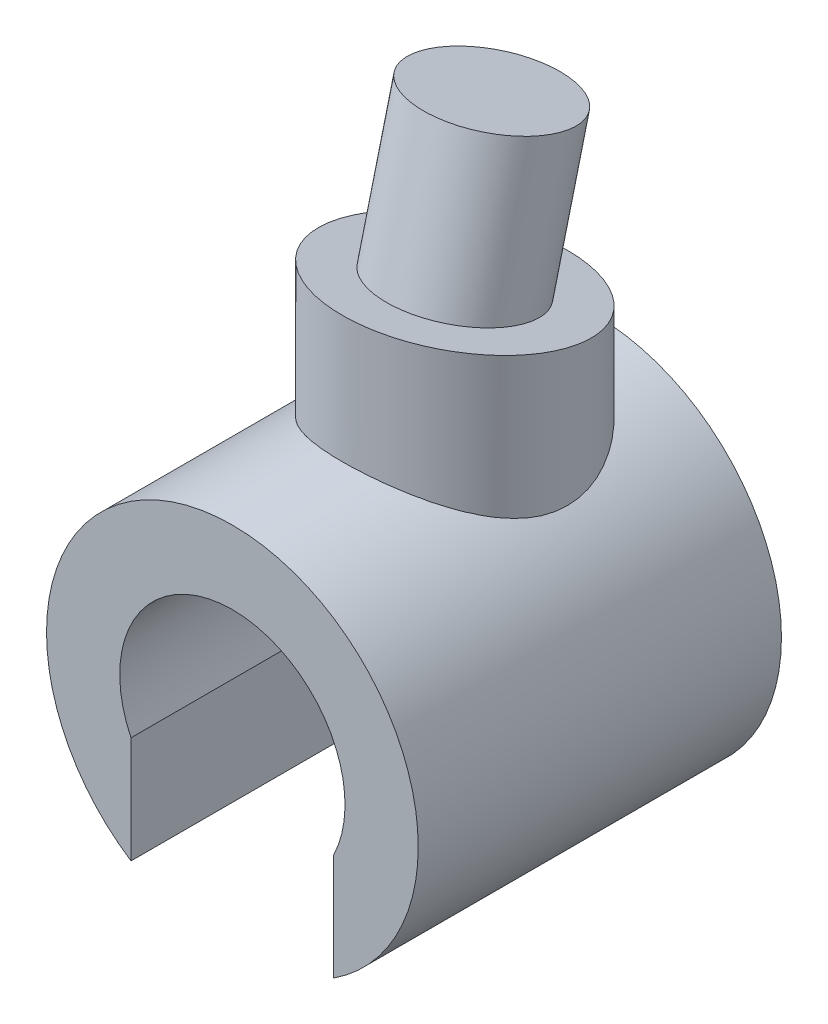
ISO-10303-21;
HEADER;
FILE_DESCRIPTION(('STEP AP214'),'2;1');
FILE_NAME('part.step','',(''),(''),'','','');
FILE_SCHEMA(('AUTOMOTIVE_DESIGN { 1 0 10303 214 1 1 1 1 }'));
ENDSEC;
DATA;
#1=APPLICATION_CONTEXT('core data for automotive mechanical design processes');
#2=APPLICATION_PROTOCOL_DEFINITION('international standard','automotive_design',2000,#1);
#3=PRODUCT_CONTEXT('',#1,'mechanical');
#4=PRODUCT('Part','Part','',(#3));
#5=PRODUCT_RELATED_PRODUCT_CATEGORY('part','',(#4));
#6=PRODUCT_DEFINITION_FORMATION('','',#4);
#7=PRODUCT_DEFINITION_CONTEXT('part definition',#1,'design');
#8=PRODUCT_DEFINITION('design','',#6,#7);
#9=PRODUCT_DEFINITION_SHAPE('','',#8);
#10=(LENGTH_UNIT() NAMED_UNIT(*) SI_UNIT(.MILLI.,.METRE.));
#11=(NAMED_UNIT(*) PLANE_ANGLE_UNIT() SI_UNIT($,.RADIAN.));
#12=(NAMED_UNIT(*) SI_UNIT($,.STERADIAN.) SOLID_ANGLE_UNIT());
#13=UNCERTAINTY_MEASURE_WITH_UNIT(LENGTH_MEASURE(1.E-05),#10,'distance_accuracy_value','');
#14=(GEOMETRIC_REPRESENTATION_CONTEXT(3) GLOBAL_UNCERTAINTY_ASSIGNED_CONTEXT((#13)) GLOBAL_UNIT_ASSIGNED_CONTEXT((#10,
#11,#12)) REPRESENTATION_CONTEXT('',''));
#15=CARTESIAN_POINT('',(0.,0.,0.));
#16=DIRECTION('',(0.,0.,1.));
#17=DIRECTION('',(1.,0.,0.));
#18=AXIS2_PLACEMENT_3D('',#15,#16,#17);
#19=CARTESIAN_POINT('',(0.,4.29644475293883,-1.45));
#20=DIRECTION('',(0.,-1.,0.));
#21=DIRECTION('',(0.,0.,-1.));
#22=AXIS2_PLACEMENT_3D('',#19,#20,#21);
#23=CYLINDRICAL_SURFACE('',#22,4.);
#24=CARTESIAN_POINT('',(0.,10.1,-1.45));
#25=DIRECTION('',(0.,-0.970142500145332,0.242535625036333));
#26=DIRECTION('',(0.,-0.242535625036333,-0.970142500145332));
#27=AXIS2_PLACEMENT_3D('',#24,#25,#26);
#28=ELLIPSE('',#27,4.12310562561766,4.);
#29=CARTESIAN_POINT('',(0.,9.1,-5.45));
#30=VERTEX_POINT('',#29);
#31=EDGE_CURVE('E54',#30,#30,#28,.F.);
#32=ORIENTED_EDGE('',*,*,#31,.F.);
#33=EDGE_LOOP('',(#32));
#34=FACE_BOUND('',#33,.T.);
#35=CARTESIAN_POINT('',(0.,4.29644475293883,-1.45));
#36=DIRECTION('',(0.,-1.,0.));
#37=DIRECTION('',(0.,0.,-1.));
#38=AXIS2_PLACEMENT_3D('',#35,#36,#37);
#39=CIRCLE('',#38,4.);
#40=CARTESIAN_POINT('',(0.,4.29644475293883,-5.45));
#41=VERTEX_POINT('',#40);
#42=EDGE_CURVE('E62',#41,#41,#39,.T.);
#43=ORIENTED_EDGE('',*,*,#42,.F.);
#44=EDGE_LOOP('',(#43));
#45=FACE_BOUND('',#44,.T.);
#46=ADVANCED_FACE('F51',(#34,#45),#23,.T.);
#47=CARTESIAN_POINT('',(0.,4.29644475293883,-5.45));
#48=DIRECTION('',(0.,-1.,0.));
#49=DIRECTION('',(0.,0.,-1.));
#50=AXIS2_PLACEMENT_3D('',#47,#48,#49);
#51=PLANE('',#50);
#52=ORIENTED_EDGE('',*,*,#42,.T.);
#53=EDGE_LOOP('',(#52));
#54=FACE_BOUND('',#53,.T.);
#55=ADVANCED_FACE('F82',(#54),#51,.T.);
#56=CARTESIAN_POINT('',(-6.6,11.1,2.55));
#57=DIRECTION('',(0.,-0.970142500145332,0.242535625036333));
#58=DIRECTION('',(0.,-0.242535625036333,-0.970142500145332));
#59=AXIS2_PLACEMENT_3D('',#56,#57,#58);
#60=PLANE('',#59);
#61=CARTESIAN_POINT('',(0.,10.1,-1.45));
#62=DIRECTION('',(0.,0.970142500145332,-0.242535625036333));
#63=DIRECTION('',(0.,0.242535625036333,0.970142500145332));
#64=AXIS2_PLACEMENT_3D('',#61,#62,#63);
#65=CIRCLE('',#64,2.5);
#66=CARTESIAN_POINT('',(0.,9.49366093740917,-3.87535625036333));
#67=VERTEX_POINT('',#66);
#68=EDGE_CURVE('E11',#67,#67,#65,.T.);
#69=ORIENTED_EDGE('',*,*,#68,.F.);
#70=EDGE_LOOP('',(#69));
#71=FACE_BOUND('',#70,.T.);
#72=ORIENTED_EDGE('',*,*,#31,.T.);
#73=EDGE_LOOP('',(#72));
#74=FACE_BOUND('',#73,.T.);
#75=ADVANCED_FACE('F75',(#71,#74),#60,.F.);
#76=CARTESIAN_POINT('',(0.,15.3387695007848,-2.7596923751962));
#77=DIRECTION('',(0.,-0.970142500145332,0.242535625036333));
#78=DIRECTION('',(0.,-0.242535625036333,-0.970142500145332));
#79=AXIS2_PLACEMENT_3D('',#76,#77,#78);
#80=CYLINDRICAL_SURFACE('',#79,2.5);
#81=CARTESIAN_POINT('',(0.,15.3387695007848,-2.7596923751962));
#82=DIRECTION('',(0.,0.970142500145332,-0.242535625036333));
#83=DIRECTION('',(0.,0.242535625036333,0.970142500145332));
#84=AXIS2_PLACEMENT_3D('',#81,#82,#83);
#85=CIRCLE('',#84,2.5);
#86=CARTESIAN_POINT('',(0.,14.732430438194,-5.18504862555953));
#87=VERTEX_POINT('',#86);
#88=EDGE_CURVE('E64',#87,#87,#85,.T.);
#89=CARTESIAN_POINT('',(0.,14.732430438194,-5.18504862555953));
#90=CARTESIAN_POINT('',(0.,14.6778599225608,-5.17140599665124));
#91=CARTESIAN_POINT('',(0.,14.6232894069276,-5.15776336774294));
#92=CARTESIAN_POINT('',(0.,14.5141483756613,-5.13047810992635));
#93=CARTESIAN_POINT('',(0.,14.4595778600281,-5.11683548101806));
#94=CARTESIAN_POINT('',(0.,14.3504368287617,-5.08955022320147));
#95=CARTESIAN_POINT('',(0.,14.2958663131286,-5.07590759429318));
#96=CARTESIAN_POINT('',(0.,14.1867252818622,-5.04862233647659));
#97=CARTESIAN_POINT('',(0.,14.132154766229,-5.0349797075683));
#98=CARTESIAN_POINT('',(0.,14.0230137349627,-5.00769444975171));
#99=CARTESIAN_POINT('',(0.,13.9684432193295,-4.99405182084342));
#100=CARTESIAN_POINT('',(0.,13.8593021880632,-4.96676656302683));
#101=CARTESIAN_POINT('',(0.,13.80473167243,-4.95312393411854));
#102=CARTESIAN_POINT('',(0.,13.6955906411636,-4.92583867630195));
#103=CARTESIAN_POINT('',(0.,13.6410201255305,-4.91219604739366));
#104=CARTESIAN_POINT('',(0.,13.5318790942641,-4.88491078957707));
#105=CARTESIAN_POINT('',(0.,13.4773085786309,-4.87126816066877));
#106=CARTESIAN_POINT('',(0.,13.3681675473646,-4.84398290285219));
#107=CARTESIAN_POINT('',(0.,13.3135970317314,-4.83034027394389));
#108=CARTESIAN_POINT('',(0.,13.2044560004651,-4.8030550161273));
#109=CARTESIAN_POINT('',(0.,13.1498854848319,-4.78941238721901));
#110=CARTESIAN_POINT('',(0.,13.0407444535655,-4.76212712940242));
#111=CARTESIAN_POINT('',(0.,12.9861739379324,-4.74848450049413));
#112=CARTESIAN_POINT('',(0.,12.877032906666,-4.72119924267754));
#113=CARTESIAN_POINT('',(0.,12.8224623910328,-4.70755661376925));
#114=CARTESIAN_POINT('',(0.,12.7133213597665,-4.68027135595266));
#115=CARTESIAN_POINT('',(0.,12.6587508441333,-4.66662872704437));
#116=CARTESIAN_POINT('',(0.,12.549609812867,-4.63934346922778));
#117=CARTESIAN_POINT('',(0.,12.4950392972338,-4.62570084031949));
#118=CARTESIAN_POINT('',(0.,12.3858982659674,-4.5984155825029));
#119=CARTESIAN_POINT('',(0.,12.3313277503343,-4.58477295359461));
#120=CARTESIAN_POINT('',(0.,12.2221867190679,-4.55748769577802));
#121=CARTESIAN_POINT('',(0.,12.1676162034347,-4.54384506686972));
#122=CARTESIAN_POINT('',(0.,12.0584751721684,-4.51655980905314));
#123=CARTESIAN_POINT('',(0.,12.0039046565352,-4.50291718014484));
#124=CARTESIAN_POINT('',(0.,11.8947636252689,-4.47563192232826));
#125=CARTESIAN_POINT('',(0.,11.8401931096357,-4.46198929341996));
#126=CARTESIAN_POINT('',(0.,11.7310520783693,-4.43470403560337));
#127=CARTESIAN_POINT('',(0.,11.6764815627362,-4.42106140669508));
#128=CARTESIAN_POINT('',(0.,11.5673405314698,-4.39377614887849));
#129=CARTESIAN_POINT('',(0.,11.5127700158366,-4.3801335199702));
#130=CARTESIAN_POINT('',(0.,11.4036289845703,-4.35284826215361));
#131=CARTESIAN_POINT('',(0.,11.3490584689371,-4.33920563324532));
#132=CARTESIAN_POINT('',(0.,11.2399174376708,-4.31192037542873));
#133=CARTESIAN_POINT('',(0.,11.1853469220376,-4.29827774652044));
#134=CARTESIAN_POINT('',(0.,11.0762058907712,-4.27099248870385));
#135=CARTESIAN_POINT('',(0.,11.0216353751381,-4.25734985979556));
#136=CARTESIAN_POINT('',(0.,10.9124943438717,-4.23006460197897));
#137=CARTESIAN_POINT('',(0.,10.8579238282385,-4.21642197307067));
#138=CARTESIAN_POINT('',(0.,10.7487827969722,-4.18913671525409));
#139=CARTESIAN_POINT('',(0.,10.694212281339,-4.17549408634579));
#140=CARTESIAN_POINT('',(0.,10.5850712500727,-4.1482088285292));
#141=CARTESIAN_POINT('',(0.,10.5305007344395,-4.13456619962091));
#142=CARTESIAN_POINT('',(0.,10.4213597031731,-4.10728094180432));
#143=CARTESIAN_POINT('',(0.,10.36678918754,-4.09363831289603));
#144=CARTESIAN_POINT('',(0.,10.2576481562736,-4.06635305507944));
#145=CARTESIAN_POINT('',(0.,10.2030776406404,-4.05271042617115));
#146=CARTESIAN_POINT('',(0.,10.0939366093741,-4.02542516835456));
#147=CARTESIAN_POINT('',(0.,10.0393660937409,-4.01178253944627));
#148=CARTESIAN_POINT('',(0.,9.93022506247456,-3.98449728162968));
#149=CARTESIAN_POINT('',(0.,9.87565454684139,-3.97085465272139));
#150=CARTESIAN_POINT('',(0.,9.76651351557504,-3.9435693949048));
#151=CARTESIAN_POINT('',(0.,9.71194299994187,-3.92992676599651));
#152=CARTESIAN_POINT('',(0.,9.60280196867552,-3.90264150817992));
#153=CARTESIAN_POINT('',(0.,9.54823145304234,-3.88899887927162));
#154=CARTESIAN_POINT('',(0.,9.49366093740917,-3.87535625036333));
#155=B_SPLINE_CURVE_WITH_KNOTS('',3,(#89,#90,#91,#92,#93,#94,#95,#96,#97,#98,#99,#100,#101,#102,
#103,#104,#105,#106,#107,#108,#109,#110,#111,#112,#113,#114,#115,#116,#117,#118,#119,#120,#121,
#122,#123,#124,#125,#126,#127,#128,#129,#130,#131,#132,#133,#134,#135,#136,#137,#138,#139,#140,
#141,#142,#143,#144,#145,#146,#147,#148,#149,#150,#151,#152,#153,#154),.UNSPECIFIED.,.F.,.F.,(4,
2,2,2,2,2,2,2,2,2,2,2,2,2,2,2,2,2,2,2,2,2,2,2,2,2,2,2,2,2,2,2,4),(0.,0.168749999999999,
0.337499999999999,0.506249999999999,0.674999999999998,0.84375,1.0125,1.18125,1.35,1.51875,
1.6875,1.85625,2.025,2.19375,2.3625,2.53125,2.7,2.86875,3.0375,3.20625,3.375,3.54375,3.7125,
3.88125,4.05,4.21875,4.3875,4.55625,4.725,4.89375,5.0625,5.23125,5.4),.UNSPECIFIED.);
#156=EDGE_CURVE('BSEAM73',#87,#67,#155,.T.);
#157=ORIENTED_EDGE('',*,*,#88,.F.);
#158=ORIENTED_EDGE('',*,*,#68,.T.);
#159=ORIENTED_EDGE('',*,*,#156,.T.);
#160=ORIENTED_EDGE('',*,*,#156,.F.);
#161=EDGE_LOOP('',(#157,#159,#158,#160));
#162=FACE_BOUND('',#161,.T.);
#163=ADVANCED_FACE('F73',(#162),#80,.T.);
#164=CARTESIAN_POINT('',(0.,15.3387695007848,-2.7596923751962));
#165=DIRECTION('',(0.,0.970142500145332,-0.242535625036333));
#166=DIRECTION('',(0.,0.242535625036333,0.970142500145332));
#167=AXIS2_PLACEMENT_3D('',#164,#165,#166);
#168=PLANE('',#167);
#169=ORIENTED_EDGE('',*,*,#88,.T.);
#170=EDGE_LOOP('',(#169));
#171=FACE_BOUND('',#170,.T.);
#172=ADVANCED_FACE('F71',(#171),#168,.T.);
#173=CLOSED_SHELL('',(#46,#55,#75,#163,#172));
#174=MANIFOLD_SOLID_BREP('B2',#173);
#175=CARTESIAN_POINT('',(0.,0.,6.45));
#176=DIRECTION('',(0.,0.,-1.));
#177=DIRECTION('',(-1.,0.,0.));
#178=AXIS2_PLACEMENT_3D('',#175,#176,#177);
#179=CYLINDRICAL_SURFACE('',#178,4.);
#180=CARTESIAN_POINT('',(0.,0.,-6.45));
#181=DIRECTION('',(0.,0.,-1.));
#182=DIRECTION('',(1.,0.,0.));
#183=AXIS2_PLACEMENT_3D('',#180,#181,#182);
#184=CIRCLE('',#183,4.);
#185=CARTESIAN_POINT('',(-3.6,-1.74355957741627,-6.45));
#186=VERTEX_POINT('',#185);
#187=CARTESIAN_POINT('',(3.6,-1.74355957741627,-6.45));
#188=VERTEX_POINT('',#187);
#189=EDGE_CURVE('E185',#186,#188,#184,.T.);
#190=ORIENTED_EDGE('',*,*,#189,.T.);
#191=DIRECTION('',(0.,0.,-1.));
#192=VECTOR('',#191,1.);
#193=CARTESIAN_POINT('',(3.6,-1.74355957741627,6.45));
#194=LINE('',#193,#192);
#195=CARTESIAN_POINT('',(3.6,-1.74355957741627,6.45));
#196=VERTEX_POINT('',#195);
#197=EDGE_CURVE('E49',#196,#188,#194,.T.);
#198=ORIENTED_EDGE('',*,*,#197,.F.);
#199=CARTESIAN_POINT('',(0.,0.,6.45));
#200=DIRECTION('',(0.,0.,-1.));
#201=DIRECTION('',(1.,0.,0.));
#202=AXIS2_PLACEMENT_3D('',#199,#200,#201);
#203=CIRCLE('',#202,4.);
#204=CARTESIAN_POINT('',(-3.6,-1.74355957741627,6.45));
#205=VERTEX_POINT('',#204);
#206=EDGE_CURVE('E173',#205,#196,#203,.T.);
#207=ORIENTED_EDGE('',*,*,#206,.F.);
#208=DIRECTION('',(0.,0.,-1.));
#209=VECTOR('',#208,1.);
#210=CARTESIAN_POINT('',(-3.6,-1.74355957741627,6.45));
#211=LINE('',#210,#209);
#212=EDGE_CURVE('E181',#205,#186,#211,.T.);
#213=ORIENTED_EDGE('',*,*,#212,.T.);
#214=EDGE_LOOP('',(#190,#198,#207,#213));
#215=FACE_BOUND('',#214,.T.);
#216=ADVANCED_FACE('F122',(#215),#179,.F.);
#217=CARTESIAN_POINT('',(3.6,-1.74355957741627,6.45));
#218=DIRECTION('',(1.,0.,0.));
#219=DIRECTION('',(0.,1.,0.));
#220=AXIS2_PLACEMENT_3D('',#217,#218,#219);
#221=PLANE('',#220);
#222=DIRECTION('',(0.,-1.,0.));
#223=VECTOR('',#222,1.);
#224=CARTESIAN_POINT('',(3.6,-1.74355957741627,-6.45));
#225=LINE('',#224,#223);
#226=CARTESIAN_POINT('',(3.6,-5.53172667437573,-6.45));
#227=VERTEX_POINT('',#226);
#228=EDGE_CURVE('E177',#188,#227,#225,.T.);
#229=ORIENTED_EDGE('',*,*,#228,.T.);
#230=DIRECTION('',(0.,0.,-1.));
#231=VECTOR('',#230,1.);
#232=CARTESIAN_POINT('',(3.6,-5.53172667437573,6.45));
#233=LINE('',#232,#231);
#234=CARTESIAN_POINT('',(3.6,-5.53172667437573,6.45));
#235=VERTEX_POINT('',#234);
#236=EDGE_CURVE('E130',#235,#227,#233,.T.);
#237=ORIENTED_EDGE('',*,*,#236,.F.);
#238=DIRECTION('',(0.,-1.,0.));
#239=VECTOR('',#238,1.);
#240=CARTESIAN_POINT('',(3.6,-1.74355957741627,6.45));
#241=LINE('',#240,#239);
#242=EDGE_CURVE('E168',#196,#235,#241,.T.);
#243=ORIENTED_EDGE('',*,*,#242,.F.);
#244=ORIENTED_EDGE('',*,*,#197,.T.);
#245=EDGE_LOOP('',(#229,#237,#243,#244));
#246=FACE_BOUND('',#245,.T.);
#247=ADVANCED_FACE('F176',(#246),#221,.F.);
#248=CARTESIAN_POINT('',(0.,0.,6.45));
#249=DIRECTION('',(0.,0.,-1.));
#250=DIRECTION('',(-1.,0.,0.));
#251=AXIS2_PLACEMENT_3D('',#248,#249,#250);
#252=CYLINDRICAL_SURFACE('',#251,6.6);
#253=CARTESIAN_POINT('',(0.,0.,-6.45));
#254=DIRECTION('',(0.,0.,1.));
#255=DIRECTION('',(1.,0.,0.));
#256=AXIS2_PLACEMENT_3D('',#253,#254,#255);
#257=CIRCLE('',#256,6.6);
#258=CARTESIAN_POINT('',(-3.6,-5.53172667437573,-6.45));
#259=VERTEX_POINT('',#258);
#260=EDGE_CURVE('E155',#227,#259,#257,.T.);
#261=ORIENTED_EDGE('',*,*,#260,.T.);
#262=DIRECTION('',(0.,0.,-1.));
#263=VECTOR('',#262,1.);
#264=CARTESIAN_POINT('',(-3.6,-5.53172667437573,6.45));
#265=LINE('',#264,#263);
#266=CARTESIAN_POINT('',(-3.6,-5.53172667437573,6.45));
#267=VERTEX_POINT('',#266);
#268=EDGE_CURVE('E178',#267,#259,#265,.T.);
#269=ORIENTED_EDGE('',*,*,#268,.F.);
#270=CARTESIAN_POINT('',(0.,0.,6.45));
#271=DIRECTION('',(0.,0.,1.));
#272=DIRECTION('',(1.,0.,0.));
#273=AXIS2_PLACEMENT_3D('',#270,#271,#272);
#274=CIRCLE('',#273,6.6);
#275=EDGE_CURVE('E171',#235,#267,#274,.T.);
#276=ORIENTED_EDGE('',*,*,#275,.F.);
#277=ORIENTED_EDGE('',*,*,#236,.T.);
#278=EDGE_LOOP('',(#261,#269,#276,#277));
#279=FACE_BOUND('',#278,.T.);
#280=ADVANCED_FACE('F179',(#279),#252,.T.);
#281=CARTESIAN_POINT('',(-3.6,-1.74355957741627,6.45));
#282=DIRECTION('',(-1.,0.,0.));
#283=DIRECTION('',(0.,-1.,0.));
#284=AXIS2_PLACEMENT_3D('',#281,#282,#283);
#285=PLANE('',#284);
#286=DIRECTION('',(0.,1.,0.));
#287=VECTOR('',#286,1.);
#288=CARTESIAN_POINT('',(-3.6,-1.74355957741627,-6.45));
#289=LINE('',#288,#287);
#290=EDGE_CURVE('E161',#259,#186,#289,.T.);
#291=ORIENTED_EDGE('',*,*,#290,.T.);
#292=ORIENTED_EDGE('',*,*,#212,.F.);
#293=DIRECTION('',(0.,1.,0.));
#294=VECTOR('',#293,1.);
#295=CARTESIAN_POINT('',(-3.6,-1.74355957741627,6.45));
#296=LINE('',#295,#294);
#297=EDGE_CURVE('E138',#267,#205,#296,.T.);
#298=ORIENTED_EDGE('',*,*,#297,.F.);
#299=ORIENTED_EDGE('',*,*,#268,.T.);
#300=EDGE_LOOP('',(#291,#292,#298,#299));
#301=FACE_BOUND('',#300,.T.);
#302=ADVANCED_FACE('F192',(#301),#285,.F.);
#303=CARTESIAN_POINT('',(0.,0.,6.45));
#304=DIRECTION('',(0.,0.,1.));
#305=DIRECTION('',(1.,0.,0.));
#306=AXIS2_PLACEMENT_3D('',#303,#304,#305);
#307=PLANE('',#306);
#308=ORIENTED_EDGE('',*,*,#206,.T.);
#309=ORIENTED_EDGE('',*,*,#242,.T.);
#310=ORIENTED_EDGE('',*,*,#275,.T.);
#311=ORIENTED_EDGE('',*,*,#297,.T.);
#312=EDGE_LOOP('',(#308,#309,#310,#311));
#313=FACE_BOUND('',#312,.T.);
#314=ADVANCED_FACE('F169',(#313),#307,.T.);
#315=CARTESIAN_POINT('',(0.,0.,-6.45));
#316=DIRECTION('',(0.,0.,1.));
#317=DIRECTION('',(1.,0.,0.));
#318=AXIS2_PLACEMENT_3D('',#315,#316,#317);
#319=PLANE('',#318);
#320=ORIENTED_EDGE('',*,*,#189,.F.);
#321=ORIENTED_EDGE('',*,*,#290,.F.);
#322=ORIENTED_EDGE('',*,*,#260,.F.);
#323=ORIENTED_EDGE('',*,*,#228,.F.);
#324=EDGE_LOOP('',(#320,#321,#322,#323));
#325=FACE_BOUND('',#324,.T.);
#326=ADVANCED_FACE('F195',(#325),#319,.F.);
#327=CLOSED_SHELL('',(#216,#247,#280,#302,#314,#326));
#328=MANIFOLD_SOLID_BREP('B6',#327);
#329=ADVANCED_BREP_SHAPE_REPRESENTATION('',(#18,#174,#328),#14);
#330=SHAPE_DEFINITION_REPRESENTATION(#9,#329);
ENDSEC;
END-ISO-10303-21;
